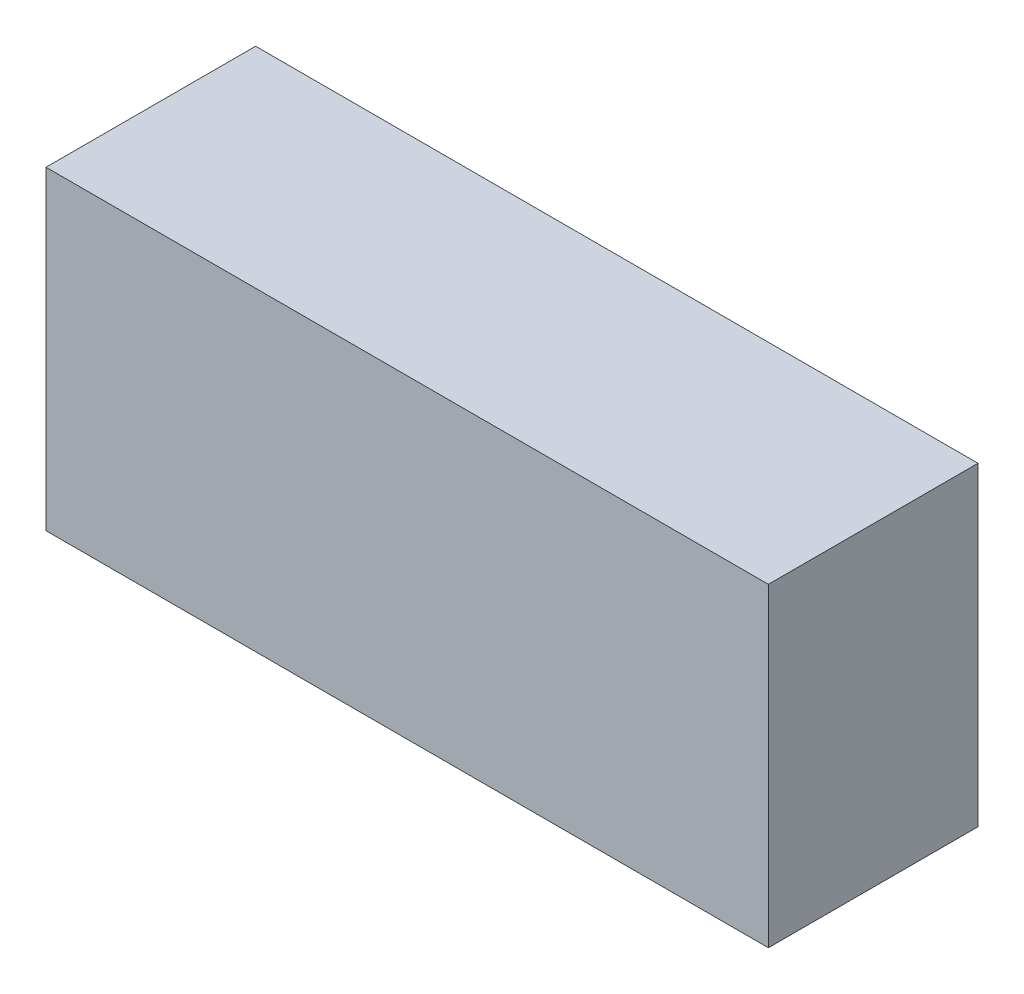
ISO-10303-21;
HEADER;
FILE_DESCRIPTION(('STEP AP214'),'2;1');
FILE_NAME('part.step','',(''),(''),'','','');
FILE_SCHEMA(('AUTOMOTIVE_DESIGN { 1 0 10303 214 1 1 1 1 }'));
ENDSEC;
DATA;
#1=APPLICATION_CONTEXT('core data for automotive mechanical design processes');
#2=APPLICATION_PROTOCOL_DEFINITION('international standard','automotive_design',2000,#1);
#3=PRODUCT_CONTEXT('',#1,'mechanical');
#4=PRODUCT('Part','Part','',(#3));
#5=PRODUCT_RELATED_PRODUCT_CATEGORY('part','',(#4));
#6=PRODUCT_DEFINITION_FORMATION('','',#4);
#7=PRODUCT_DEFINITION_CONTEXT('part definition',#1,'design');
#8=PRODUCT_DEFINITION('design','',#6,#7);
#9=PRODUCT_DEFINITION_SHAPE('','',#8);
#10=(LENGTH_UNIT() NAMED_UNIT(*) SI_UNIT(.MILLI.,.METRE.));
#11=(NAMED_UNIT(*) PLANE_ANGLE_UNIT() SI_UNIT($,.RADIAN.));
#12=(NAMED_UNIT(*) SI_UNIT($,.STERADIAN.) SOLID_ANGLE_UNIT());
#13=UNCERTAINTY_MEASURE_WITH_UNIT(LENGTH_MEASURE(1.E-05),#10,'distance_accuracy_value','');
#14=(GEOMETRIC_REPRESENTATION_CONTEXT(3) GLOBAL_UNCERTAINTY_ASSIGNED_CONTEXT((#13)) GLOBAL_UNIT_ASSIGNED_CONTEXT((#10,
#11,#12)) REPRESENTATION_CONTEXT('',''));
#15=CARTESIAN_POINT('',(0.,0.,0.));
#16=DIRECTION('',(0.,0.,1.));
#17=DIRECTION('',(1.,0.,0.));
#18=AXIS2_PLACEMENT_3D('',#15,#16,#17);
#19=CARTESIAN_POINT('',(0.,0.,1.));
#20=DIRECTION('',(0.,0.,1.));
#21=DIRECTION('',(1.,0.,0.));
#22=AXIS2_PLACEMENT_3D('',#19,#20,#21);
#23=PLANE('',#22);
#24=DIRECTION('',(1.,0.,0.));
#25=VECTOR('',#24,1.);
#26=CARTESIAN_POINT('',(1.723,0.8016,1.));
#27=LINE('',#26,#25);
#28=CARTESIAN_POINT('',(-1.723,0.8016,1.));
#29=VERTEX_POINT('',#28);
#30=CARTESIAN_POINT('',(1.723,0.8016,1.));
#31=VERTEX_POINT('',#30);
#32=EDGE_CURVE('E68',#29,#31,#27,.T.);
#33=ORIENTED_EDGE('',*,*,#32,.F.);
#34=DIRECTION('',(0.,1.,0.));
#35=VECTOR('',#34,1.);
#36=CARTESIAN_POINT('',(-1.723,0.8016,1.));
#37=LINE('',#36,#35);
#38=CARTESIAN_POINT('',(-1.723,-0.7,1.));
#39=VERTEX_POINT('',#38);
#40=EDGE_CURVE('E20',#39,#29,#37,.T.);
#41=ORIENTED_EDGE('',*,*,#40,.F.);
#42=DIRECTION('',(1.,0.,0.));
#43=VECTOR('',#42,1.);
#44=CARTESIAN_POINT('',(-1.723,-0.7,1.));
#45=LINE('',#44,#43);
#46=CARTESIAN_POINT('',(1.723,-0.7,1.));
#47=VERTEX_POINT('',#46);
#48=EDGE_CURVE('E58',#47,#39,#45,.F.);
#49=ORIENTED_EDGE('',*,*,#48,.F.);
#50=DIRECTION('',(0.,1.,0.));
#51=VECTOR('',#50,1.);
#52=CARTESIAN_POINT('',(1.723,-0.7,1.));
#53=LINE('',#52,#51);
#54=EDGE_CURVE('E53',#31,#47,#53,.F.);
#55=ORIENTED_EDGE('',*,*,#54,.F.);
#56=EDGE_LOOP('',(#33,#41,#49,#55));
#57=FACE_BOUND('',#56,.T.);
#58=ADVANCED_FACE('F17',(#57),#23,.T.);
#59=CARTESIAN_POINT('',(-1.723,0.8016,0.));
#60=DIRECTION('',(-1.,0.,0.));
#61=DIRECTION('',(0.,0.,1.));
#62=AXIS2_PLACEMENT_3D('',#59,#60,#61);
#63=PLANE('',#62);
#64=DIRECTION('',(0.,0.,1.));
#65=VECTOR('',#64,1.);
#66=CARTESIAN_POINT('',(-1.723,0.8016,0.));
#67=LINE('',#66,#65);
#68=CARTESIAN_POINT('',(-1.723,0.8016,0.));
#69=VERTEX_POINT('',#68);
#70=EDGE_CURVE('E79',#69,#29,#67,.T.);
#71=ORIENTED_EDGE('',*,*,#70,.F.);
#72=DIRECTION('',(0.,1.,0.));
#73=VECTOR('',#72,1.);
#74=CARTESIAN_POINT('',(-1.723,0.,0.));
#75=LINE('',#74,#73);
#76=CARTESIAN_POINT('',(-1.723,-0.7,0.));
#77=VERTEX_POINT('',#76);
#78=EDGE_CURVE('E74',#69,#77,#75,.F.);
#79=ORIENTED_EDGE('',*,*,#78,.T.);
#80=DIRECTION('',(0.,0.,-1.));
#81=VECTOR('',#80,1.);
#82=CARTESIAN_POINT('',(-1.723,-0.7,0.));
#83=LINE('',#82,#81);
#84=EDGE_CURVE('E63',#39,#77,#83,.T.);
#85=ORIENTED_EDGE('',*,*,#84,.F.);
#86=ORIENTED_EDGE('',*,*,#40,.T.);
#87=EDGE_LOOP('',(#71,#79,#85,#86));
#88=FACE_BOUND('',#87,.T.);
#89=ADVANCED_FACE('F73',(#88),#63,.T.);
#90=CARTESIAN_POINT('',(-1.723,-0.7,0.));
#91=DIRECTION('',(0.,-1.,0.));
#92=DIRECTION('',(0.,0.,-1.));
#93=AXIS2_PLACEMENT_3D('',#90,#91,#92);
#94=PLANE('',#93);
#95=ORIENTED_EDGE('',*,*,#84,.T.);
#96=DIRECTION('',(1.,0.,0.));
#97=VECTOR('',#96,1.);
#98=CARTESIAN_POINT('',(0.,-0.7,0.));
#99=LINE('',#98,#97);
#100=CARTESIAN_POINT('',(1.723,-0.7,0.));
#101=VERTEX_POINT('',#100);
#102=EDGE_CURVE('E84',#77,#101,#99,.T.);
#103=ORIENTED_EDGE('',*,*,#102,.T.);
#104=DIRECTION('',(0.,0.,-1.));
#105=VECTOR('',#104,1.);
#106=CARTESIAN_POINT('',(1.723,-0.7,0.));
#107=LINE('',#106,#105);
#108=EDGE_CURVE('E65',#47,#101,#107,.T.);
#109=ORIENTED_EDGE('',*,*,#108,.F.);
#110=ORIENTED_EDGE('',*,*,#48,.T.);
#111=EDGE_LOOP('',(#95,#103,#109,#110));
#112=FACE_BOUND('',#111,.T.);
#113=ADVANCED_FACE('F60',(#112),#94,.T.);
#114=CARTESIAN_POINT('',(1.723,-0.7,0.));
#115=DIRECTION('',(1.,0.,0.));
#116=DIRECTION('',(0.,0.,-1.));
#117=AXIS2_PLACEMENT_3D('',#114,#115,#116);
#118=PLANE('',#117);
#119=ORIENTED_EDGE('',*,*,#108,.T.);
#120=DIRECTION('',(0.,1.,0.));
#121=VECTOR('',#120,1.);
#122=CARTESIAN_POINT('',(1.723,0.,0.));
#123=LINE('',#122,#121);
#124=CARTESIAN_POINT('',(1.723,0.8016,0.));
#125=VERTEX_POINT('',#124);
#126=EDGE_CURVE('E26',#101,#125,#123,.T.);
#127=ORIENTED_EDGE('',*,*,#126,.T.);
#128=DIRECTION('',(0.,0.,1.));
#129=VECTOR('',#128,1.);
#130=CARTESIAN_POINT('',(1.723,0.8016,0.));
#131=LINE('',#130,#129);
#132=EDGE_CURVE('E34',#31,#125,#131,.F.);
#133=ORIENTED_EDGE('',*,*,#132,.F.);
#134=ORIENTED_EDGE('',*,*,#54,.T.);
#135=EDGE_LOOP('',(#119,#127,#133,#134));
#136=FACE_BOUND('',#135,.T.);
#137=ADVANCED_FACE('F88',(#136),#118,.T.);
#138=CARTESIAN_POINT('',(1.723,0.8016,0.));
#139=DIRECTION('',(0.,1.,0.));
#140=DIRECTION('',(0.,0.,1.));
#141=AXIS2_PLACEMENT_3D('',#138,#139,#140);
#142=PLANE('',#141);
#143=ORIENTED_EDGE('',*,*,#132,.T.);
#144=DIRECTION('',(1.,0.,0.));
#145=VECTOR('',#144,1.);
#146=CARTESIAN_POINT('',(0.,0.8016,0.));
#147=LINE('',#146,#145);
#148=EDGE_CURVE('E11',#125,#69,#147,.F.);
#149=ORIENTED_EDGE('',*,*,#148,.T.);
#150=ORIENTED_EDGE('',*,*,#70,.T.);
#151=ORIENTED_EDGE('',*,*,#32,.T.);
#152=EDGE_LOOP('',(#143,#149,#150,#151));
#153=FACE_BOUND('',#152,.T.);
#154=ADVANCED_FACE('F91',(#153),#142,.T.);
#155=CARTESIAN_POINT('',(0.,0.,0.));
#156=DIRECTION('',(0.,0.,1.));
#157=DIRECTION('',(1.,0.,0.));
#158=AXIS2_PLACEMENT_3D('',#155,#156,#157);
#159=PLANE('',#158);
#160=ORIENTED_EDGE('',*,*,#126,.F.);
#161=ORIENTED_EDGE('',*,*,#102,.F.);
#162=ORIENTED_EDGE('',*,*,#78,.F.);
#163=ORIENTED_EDGE('',*,*,#148,.F.);
#164=EDGE_LOOP('',(#160,#161,#162,#163));
#165=FACE_BOUND('',#164,.T.);
#166=ADVANCED_FACE('F90',(#165),#159,.F.);
#167=CLOSED_SHELL('',(#58,#89,#113,#137,#154,#166));
#168=MANIFOLD_SOLID_BREP('B1',#167);
#169=ADVANCED_BREP_SHAPE_REPRESENTATION('',(#18,#168),#14);
#170=SHAPE_DEFINITION_REPRESENTATION(#9,#169);
ENDSEC;
END-ISO-10303-21;
